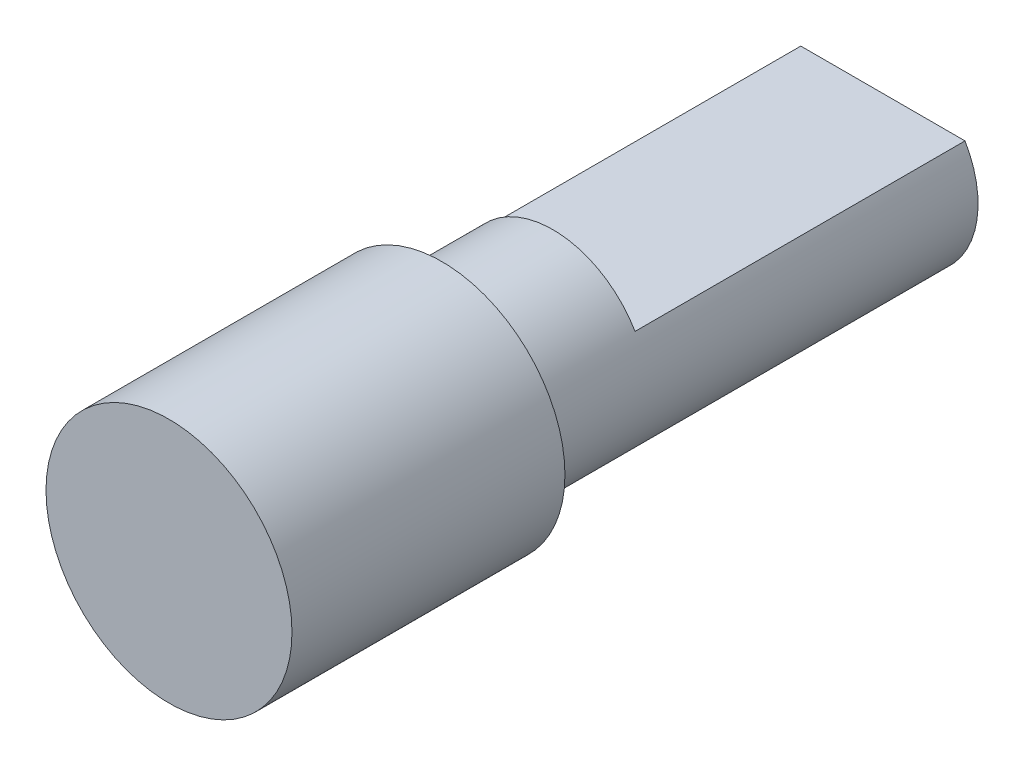
ISO-10303-21;
HEADER;
FILE_DESCRIPTION(('STEP AP214'),'2;1');
FILE_NAME('part.step','',(''),(''),'','','');
FILE_SCHEMA(('AUTOMOTIVE_DESIGN { 1 0 10303 214 1 1 1 1 }'));
ENDSEC;
DATA;
#1=APPLICATION_CONTEXT('core data for automotive mechanical design processes');
#2=APPLICATION_PROTOCOL_DEFINITION('international standard','automotive_design',2000,#1);
#3=PRODUCT_CONTEXT('',#1,'mechanical');
#4=PRODUCT('Part','Part','',(#3));
#5=PRODUCT_RELATED_PRODUCT_CATEGORY('part','',(#4));
#6=PRODUCT_DEFINITION_FORMATION('','',#4);
#7=PRODUCT_DEFINITION_CONTEXT('part definition',#1,'design');
#8=PRODUCT_DEFINITION('design','',#6,#7);
#9=PRODUCT_DEFINITION_SHAPE('','',#8);
#10=(LENGTH_UNIT() NAMED_UNIT(*) SI_UNIT(.MILLI.,.METRE.));
#11=(NAMED_UNIT(*) PLANE_ANGLE_UNIT() SI_UNIT($,.RADIAN.));
#12=(NAMED_UNIT(*) SI_UNIT($,.STERADIAN.) SOLID_ANGLE_UNIT());
#13=UNCERTAINTY_MEASURE_WITH_UNIT(LENGTH_MEASURE(1.E-05),#10,'distance_accuracy_value','');
#14=(GEOMETRIC_REPRESENTATION_CONTEXT(3) GLOBAL_UNCERTAINTY_ASSIGNED_CONTEXT((#13)) GLOBAL_UNIT_ASSIGNED_CONTEXT((#10,
#11,#12)) REPRESENTATION_CONTEXT('',''));
#15=CARTESIAN_POINT('',(0.,0.,0.));
#16=DIRECTION('',(0.,0.,1.));
#17=DIRECTION('',(1.,0.,0.));
#18=AXIS2_PLACEMENT_3D('',#15,#16,#17);
#19=CARTESIAN_POINT('',(0.,0.,9.1));
#20=DIRECTION('',(0.,0.,-1.));
#21=DIRECTION('',(-1.,0.,0.));
#22=AXIS2_PLACEMENT_3D('',#19,#20,#21);
#23=CYLINDRICAL_SURFACE('',#22,4.1);
#24=CARTESIAN_POINT('',(0.,0.,9.1));
#25=DIRECTION('',(0.,0.,1.));
#26=DIRECTION('',(1.,0.,0.));
#27=AXIS2_PLACEMENT_3D('',#24,#25,#26);
#28=CIRCLE('',#27,4.1);
#29=CARTESIAN_POINT('',(4.1,0.,9.1));
#30=VERTEX_POINT('',#29);
#31=EDGE_CURVE('E48',#30,#30,#28,.T.);
#32=ORIENTED_EDGE('',*,*,#31,.F.);
#33=EDGE_LOOP('',(#32));
#34=FACE_BOUND('',#33,.T.);
#35=CARTESIAN_POINT('',(0.,0.,0.));
#36=DIRECTION('',(0.,0.,1.));
#37=DIRECTION('',(1.,0.,0.));
#38=AXIS2_PLACEMENT_3D('',#35,#36,#37);
#39=CIRCLE('',#38,4.1);
#40=CARTESIAN_POINT('',(4.1,0.,0.));
#41=VERTEX_POINT('',#40);
#42=EDGE_CURVE('E42',#41,#41,#39,.T.);
#43=ORIENTED_EDGE('',*,*,#42,.T.);
#44=EDGE_LOOP('',(#43));
#45=FACE_BOUND('',#44,.T.);
#46=ADVANCED_FACE('F39',(#34,#45),#23,.T.);
#47=CARTESIAN_POINT('',(0.,0.,9.1));
#48=DIRECTION('',(0.,0.,1.));
#49=DIRECTION('',(1.,0.,0.));
#50=AXIS2_PLACEMENT_3D('',#47,#48,#49);
#51=PLANE('',#50);
#52=ORIENTED_EDGE('',*,*,#31,.T.);
#53=EDGE_LOOP('',(#52));
#54=FACE_BOUND('',#53,.T.);
#55=ADVANCED_FACE('F92',(#54),#51,.T.);
#56=CARTESIAN_POINT('',(0.,0.,0.));
#57=DIRECTION('',(0.,0.,1.));
#58=DIRECTION('',(1.,0.,0.));
#59=AXIS2_PLACEMENT_3D('',#56,#57,#58);
#60=PLANE('',#59);
#61=CARTESIAN_POINT('',(0.,0.,0.));
#62=DIRECTION('',(0.,0.,-1.));
#63=DIRECTION('',(-1.,0.,0.));
#64=AXIS2_PLACEMENT_3D('',#61,#62,#63);
#65=CIRCLE('',#64,3.1725);
#66=CARTESIAN_POINT('',(-3.1725,0.,0.));
#67=VERTEX_POINT('',#66);
#68=EDGE_CURVE('E11',#67,#67,#65,.T.);
#69=ORIENTED_EDGE('',*,*,#68,.F.);
#70=EDGE_LOOP('',(#69));
#71=FACE_BOUND('',#70,.T.);
#72=ORIENTED_EDGE('',*,*,#42,.F.);
#73=EDGE_LOOP('',(#72));
#74=FACE_BOUND('',#73,.T.);
#75=ADVANCED_FACE('F98',(#71,#74),#60,.F.);
#76=CARTESIAN_POINT('',(0.,0.,-14.7));
#77=DIRECTION('',(0.,0.,1.));
#78=DIRECTION('',(1.,0.,0.));
#79=AXIS2_PLACEMENT_3D('',#76,#77,#78);
#80=CYLINDRICAL_SURFACE('',#79,3.1725);
#81=CARTESIAN_POINT('',(0.,0.,-14.7));
#82=DIRECTION('',(0.,0.,-1.));
#83=DIRECTION('',(-1.,0.,0.));
#84=AXIS2_PLACEMENT_3D('',#81,#82,#83);
#85=CIRCLE('',#84,3.1725);
#86=CARTESIAN_POINT('',(2.73765110568686,1.60312902585272,-14.7));
#87=VERTEX_POINT('',#86);
#88=CARTESIAN_POINT('',(-2.73765110568686,1.60312902585272,-14.7));
#89=VERTEX_POINT('',#88);
#90=EDGE_CURVE('E79',#87,#89,#85,.T.);
#91=ORIENTED_EDGE('',*,*,#90,.F.);
#92=DIRECTION('',(0.,0.,-1.));
#93=VECTOR('',#92,1.);
#94=CARTESIAN_POINT('',(2.73765110568686,1.60312902585272,-3.7));
#95=LINE('',#94,#93);
#96=CARTESIAN_POINT('',(2.73765110568686,1.60312902585272,-3.7));
#97=VERTEX_POINT('',#96);
#98=EDGE_CURVE('E56',#97,#87,#95,.T.);
#99=ORIENTED_EDGE('',*,*,#98,.F.);
#100=CARTESIAN_POINT('',(0.,0.,-3.7));
#101=DIRECTION('',(0.,0.,-1.));
#102=DIRECTION('',(1.,0.,0.));
#103=AXIS2_PLACEMENT_3D('',#100,#101,#102);
#104=CIRCLE('',#103,3.1725);
#105=CARTESIAN_POINT('',(-2.73765110568686,1.60312902585272,-3.7));
#106=VERTEX_POINT('',#105);
#107=EDGE_CURVE('E73',#106,#97,#104,.T.);
#108=ORIENTED_EDGE('',*,*,#107,.F.);
#109=DIRECTION('',(0.,0.,-1.));
#110=VECTOR('',#109,1.);
#111=CARTESIAN_POINT('',(-2.73765110568686,1.60312902585272,-3.7));
#112=LINE('',#111,#110);
#113=EDGE_CURVE('E62',#106,#89,#112,.T.);
#114=ORIENTED_EDGE('',*,*,#113,.T.);
#115=EDGE_LOOP('',(#91,#99,#108,#114));
#116=FACE_BOUND('',#115,.T.);
#117=ORIENTED_EDGE('',*,*,#68,.T.);
#118=EDGE_LOOP('',(#117));
#119=FACE_BOUND('',#118,.T.);
#120=ADVANCED_FACE('F77',(#116,#119),#80,.T.);
#121=CARTESIAN_POINT('',(0.,0.,-14.7));
#122=DIRECTION('',(0.,0.,-1.));
#123=DIRECTION('',(-1.,0.,0.));
#124=AXIS2_PLACEMENT_3D('',#121,#122,#123);
#125=PLANE('',#124);
#126=DIRECTION('',(-1.,0.,0.));
#127=VECTOR('',#126,1.);
#128=CARTESIAN_POINT('',(2.73765110568686,1.60312902585272,-14.7));
#129=LINE('',#128,#127);
#130=EDGE_CURVE('E67',#87,#89,#129,.T.);
#131=ORIENTED_EDGE('',*,*,#130,.F.);
#132=ORIENTED_EDGE('',*,*,#90,.T.);
#133=EDGE_LOOP('',(#131,#132));
#134=FACE_BOUND('',#133,.T.);
#135=ADVANCED_FACE('F82',(#134),#125,.T.);
#136=CARTESIAN_POINT('',(2.73765110568686,1.60312902585272,-3.7));
#137=DIRECTION('',(0.,-1.,0.));
#138=DIRECTION('',(0.,0.,-1.));
#139=AXIS2_PLACEMENT_3D('',#136,#137,#138);
#140=PLANE('',#139);
#141=ORIENTED_EDGE('',*,*,#130,.T.);
#142=ORIENTED_EDGE('',*,*,#113,.F.);
#143=DIRECTION('',(-1.,0.,0.));
#144=VECTOR('',#143,1.);
#145=CARTESIAN_POINT('',(2.73765110568686,1.60312902585272,-3.7));
#146=LINE('',#145,#144);
#147=EDGE_CURVE('E118',#97,#106,#146,.T.);
#148=ORIENTED_EDGE('',*,*,#147,.F.);
#149=ORIENTED_EDGE('',*,*,#98,.T.);
#150=EDGE_LOOP('',(#141,#142,#148,#149));
#151=FACE_BOUND('',#150,.T.);
#152=ADVANCED_FACE('F68',(#151),#140,.F.);
#153=CARTESIAN_POINT('',(0.,0.,-3.7));
#154=DIRECTION('',(0.,0.,1.));
#155=DIRECTION('',(1.,0.,0.));
#156=AXIS2_PLACEMENT_3D('',#153,#154,#155);
#157=PLANE('',#156);
#158=ORIENTED_EDGE('',*,*,#107,.T.);
#159=ORIENTED_EDGE('',*,*,#147,.T.);
#160=EDGE_LOOP('',(#158,#159));
#161=FACE_BOUND('',#160,.T.);
#162=ADVANCED_FACE('F113',(#161),#157,.F.);
#163=CLOSED_SHELL('',(#46,#55,#75,#120,#135,#152,#162));
#164=MANIFOLD_SOLID_BREP('B2',#163);
#165=ADVANCED_BREP_SHAPE_REPRESENTATION('',(#18,#164),#14);
#166=SHAPE_DEFINITION_REPRESENTATION(#9,#165);
ENDSEC;
END-ISO-10303-21;
